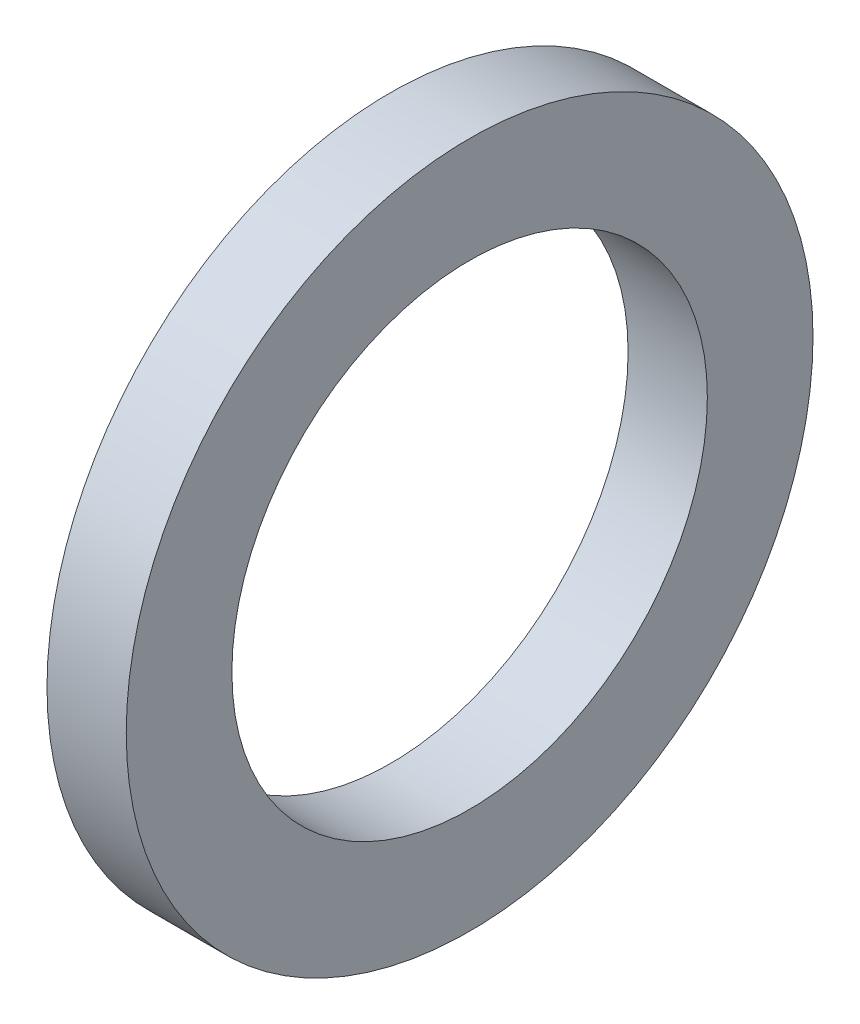
ISO-10303-21;
HEADER;
FILE_DESCRIPTION(('STEP AP214'),'2;1');
FILE_NAME('part.step','',(''),(''),'','','');
FILE_SCHEMA(('AUTOMOTIVE_DESIGN { 1 0 10303 214 1 1 1 1 }'));
ENDSEC;
DATA;
#1=APPLICATION_CONTEXT('core data for automotive mechanical design processes');
#2=APPLICATION_PROTOCOL_DEFINITION('international standard','automotive_design',2000,#1);
#3=PRODUCT_CONTEXT('',#1,'mechanical');
#4=PRODUCT('Part','Part','',(#3));
#5=PRODUCT_RELATED_PRODUCT_CATEGORY('part','',(#4));
#6=PRODUCT_DEFINITION_FORMATION('','',#4);
#7=PRODUCT_DEFINITION_CONTEXT('part definition',#1,'design');
#8=PRODUCT_DEFINITION('design','',#6,#7);
#9=PRODUCT_DEFINITION_SHAPE('','',#8);
#10=(LENGTH_UNIT() NAMED_UNIT(*) SI_UNIT(.MILLI.,.METRE.));
#11=(NAMED_UNIT(*) PLANE_ANGLE_UNIT() SI_UNIT($,.RADIAN.));
#12=(NAMED_UNIT(*) SI_UNIT($,.STERADIAN.) SOLID_ANGLE_UNIT());
#13=UNCERTAINTY_MEASURE_WITH_UNIT(LENGTH_MEASURE(1.E-05),#10,'distance_accuracy_value','');
#14=(GEOMETRIC_REPRESENTATION_CONTEXT(3) GLOBAL_UNCERTAINTY_ASSIGNED_CONTEXT((#13)) GLOBAL_UNIT_ASSIGNED_CONTEXT((#10,
#11,#12)) REPRESENTATION_CONTEXT('',''));
#15=CARTESIAN_POINT('',(0.,0.,0.));
#16=DIRECTION('',(0.,0.,1.));
#17=DIRECTION('',(1.,0.,0.));
#18=AXIS2_PLACEMENT_3D('',#15,#16,#17);
#19=CARTESIAN_POINT('',(15.,0.,0.));
#20=DIRECTION('',(1.,0.,0.));
#21=DIRECTION('',(0.,0.,-1.));
#22=AXIS2_PLACEMENT_3D('',#19,#20,#21);
#23=PLANE('',#22);
#24=CARTESIAN_POINT('',(15.,0.,0.));
#25=DIRECTION('',(1.,0.,0.));
#26=DIRECTION('',(0.,0.,-1.));
#27=AXIS2_PLACEMENT_3D('',#24,#25,#26);
#28=CIRCLE('',#27,65.);
#29=CARTESIAN_POINT('',(15.,0.,-65.));
#30=VERTEX_POINT('',#29);
#31=EDGE_CURVE('E10',#30,#30,#28,.T.);
#32=ORIENTED_EDGE('',*,*,#31,.T.);
#33=EDGE_LOOP('',(#32));
#34=FACE_BOUND('',#33,.T.);
#35=CARTESIAN_POINT('',(15.,0.,0.));
#36=DIRECTION('',(1.,0.,0.));
#37=DIRECTION('',(0.,0.,-1.));
#38=AXIS2_PLACEMENT_3D('',#35,#36,#37);
#39=CIRCLE('',#38,45.);
#40=CARTESIAN_POINT('',(15.,0.,-45.));
#41=VERTEX_POINT('',#40);
#42=EDGE_CURVE('E45',#41,#41,#39,.T.);
#43=ORIENTED_EDGE('',*,*,#42,.F.);
#44=EDGE_LOOP('',(#43));
#45=FACE_BOUND('',#44,.T.);
#46=ADVANCED_FACE('F34',(#34,#45),#23,.T.);
#47=CARTESIAN_POINT('',(0.,0.,0.));
#48=DIRECTION('',(1.,0.,0.));
#49=DIRECTION('',(0.,0.,-1.));
#50=AXIS2_PLACEMENT_3D('',#47,#48,#49);
#51=PLANE('',#50);
#52=CARTESIAN_POINT('',(0.,0.,0.));
#53=DIRECTION('',(1.,0.,0.));
#54=DIRECTION('',(0.,0.,-1.));
#55=AXIS2_PLACEMENT_3D('',#52,#53,#54);
#56=CIRCLE('',#55,65.);
#57=CARTESIAN_POINT('',(0.,0.,-65.));
#58=VERTEX_POINT('',#57);
#59=EDGE_CURVE('E38',#58,#58,#56,.T.);
#60=ORIENTED_EDGE('',*,*,#59,.F.);
#61=EDGE_LOOP('',(#60));
#62=FACE_BOUND('',#61,.T.);
#63=CARTESIAN_POINT('',(0.,0.,0.));
#64=DIRECTION('',(1.,0.,0.));
#65=DIRECTION('',(0.,0.,-1.));
#66=AXIS2_PLACEMENT_3D('',#63,#64,#65);
#67=CIRCLE('',#66,45.);
#68=CARTESIAN_POINT('',(0.,0.,-45.));
#69=VERTEX_POINT('',#68);
#70=EDGE_CURVE('E47',#69,#69,#67,.T.);
#71=ORIENTED_EDGE('',*,*,#70,.T.);
#72=EDGE_LOOP('',(#71));
#73=FACE_BOUND('',#72,.T.);
#74=ADVANCED_FACE('F57',(#62,#73),#51,.F.);
#75=CARTESIAN_POINT('',(15.,0.,0.));
#76=DIRECTION('',(-1.,0.,0.));
#77=DIRECTION('',(0.,0.,1.));
#78=AXIS2_PLACEMENT_3D('',#75,#76,#77);
#79=CYLINDRICAL_SURFACE('',#78,65.);
#80=ORIENTED_EDGE('',*,*,#31,.F.);
#81=EDGE_LOOP('',(#80));
#82=FACE_BOUND('',#81,.T.);
#83=ORIENTED_EDGE('',*,*,#59,.T.);
#84=EDGE_LOOP('',(#83));
#85=FACE_BOUND('',#84,.T.);
#86=ADVANCED_FACE('F36',(#82,#85),#79,.T.);
#87=CARTESIAN_POINT('',(15.,0.,0.));
#88=DIRECTION('',(-1.,0.,0.));
#89=DIRECTION('',(0.,0.,1.));
#90=AXIS2_PLACEMENT_3D('',#87,#88,#89);
#91=CYLINDRICAL_SURFACE('',#90,45.);
#92=ORIENTED_EDGE('',*,*,#42,.T.);
#93=EDGE_LOOP('',(#92));
#94=FACE_BOUND('',#93,.T.);
#95=ORIENTED_EDGE('',*,*,#70,.F.);
#96=EDGE_LOOP('',(#95));
#97=FACE_BOUND('',#96,.T.);
#98=ADVANCED_FACE('F53',(#94,#97),#91,.F.);
#99=CLOSED_SHELL('',(#46,#74,#86,#98));
#100=MANIFOLD_SOLID_BREP('B2',#99);
#101=ADVANCED_BREP_SHAPE_REPRESENTATION('',(#18,#100),#14);
#102=SHAPE_DEFINITION_REPRESENTATION(#9,#101);
ENDSEC;
END-ISO-10303-21;
